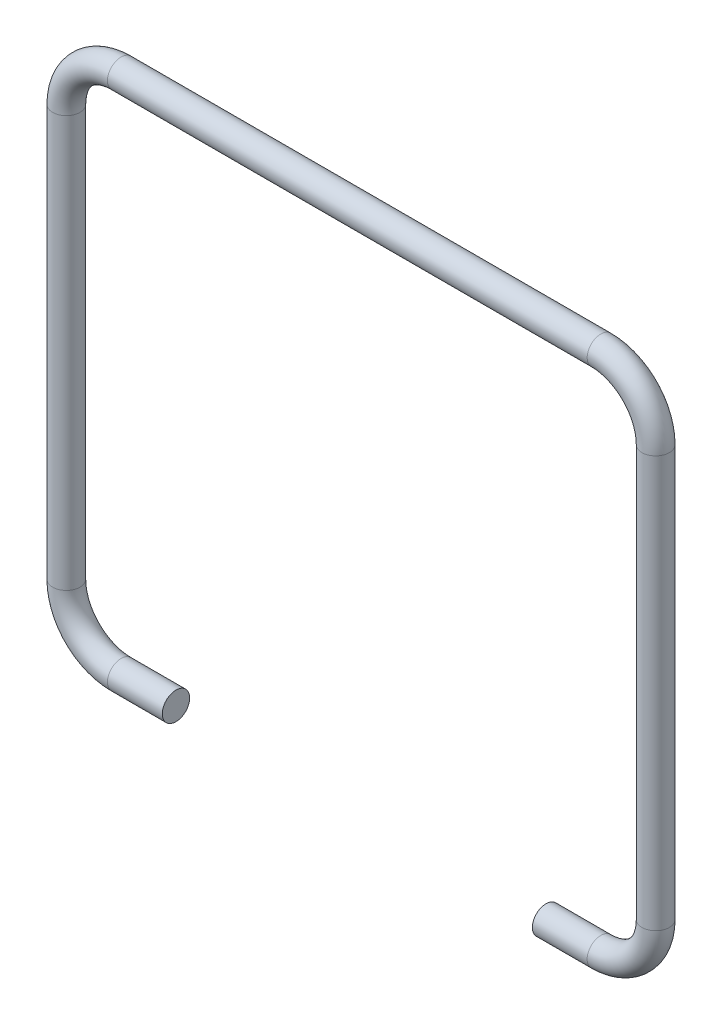
ISO-10303-21;
HEADER;
FILE_DESCRIPTION(('STEP AP214'),'2;1');
FILE_NAME('part.step','',(''),(''),'','','');
FILE_SCHEMA(('AUTOMOTIVE_DESIGN { 1 0 10303 214 1 1 1 1 }'));
ENDSEC;
DATA;
#1=APPLICATION_CONTEXT('core data for automotive mechanical design processes');
#2=APPLICATION_PROTOCOL_DEFINITION('international standard','automotive_design',2000,#1);
#3=PRODUCT_CONTEXT('',#1,'mechanical');
#4=PRODUCT('Part','Part','',(#3));
#5=PRODUCT_RELATED_PRODUCT_CATEGORY('part','',(#4));
#6=PRODUCT_DEFINITION_FORMATION('','',#4);
#7=PRODUCT_DEFINITION_CONTEXT('part definition',#1,'design');
#8=PRODUCT_DEFINITION('design','',#6,#7);
#9=PRODUCT_DEFINITION_SHAPE('','',#8);
#10=(LENGTH_UNIT() NAMED_UNIT(*) SI_UNIT(.MILLI.,.METRE.));
#11=(NAMED_UNIT(*) PLANE_ANGLE_UNIT() SI_UNIT($,.RADIAN.));
#12=(NAMED_UNIT(*) SI_UNIT($,.STERADIAN.) SOLID_ANGLE_UNIT());
#13=UNCERTAINTY_MEASURE_WITH_UNIT(LENGTH_MEASURE(1.E-05),#10,'distance_accuracy_value','');
#14=(GEOMETRIC_REPRESENTATION_CONTEXT(3) GLOBAL_UNCERTAINTY_ASSIGNED_CONTEXT((#13)) GLOBAL_UNIT_ASSIGNED_CONTEXT((#10,
#11,#12)) REPRESENTATION_CONTEXT('',''));
#15=CARTESIAN_POINT('',(0.,0.,0.));
#16=DIRECTION('',(0.,0.,1.));
#17=DIRECTION('',(1.,0.,0.));
#18=AXIS2_PLACEMENT_3D('',#15,#16,#17);
#19=CARTESIAN_POINT('',(6.75,0.,0.));
#20=DIRECTION('',(1.,0.,0.));
#21=DIRECTION('',(0.,1.,0.));
#22=AXIS2_PLACEMENT_3D('',#19,#20,#21);
#23=PLANE('',#22);
#24=CARTESIAN_POINT('',(6.75,0.,0.));
#25=DIRECTION('',(1.,0.,0.));
#26=DIRECTION('',(0.,1.,0.));
#27=AXIS2_PLACEMENT_3D('',#24,#25,#26);
#28=CIRCLE('',#27,0.5);
#29=CARTESIAN_POINT('',(6.75,0.5,0.));
#30=VERTEX_POINT('',#29);
#31=EDGE_CURVE('E85',#30,#30,#28,.T.);
#32=ORIENTED_EDGE('',*,*,#31,.F.);
#33=EDGE_LOOP('',(#32));
#34=FACE_BOUND('',#33,.T.);
#35=ADVANCED_FACE('F51',(#34),#23,.F.);
#36=CARTESIAN_POINT('',(-6.75,0.,0.));
#37=DIRECTION('',(1.,0.,0.));
#38=DIRECTION('',(0.,1.,0.));
#39=AXIS2_PLACEMENT_3D('',#36,#37,#38);
#40=PLANE('',#39);
#41=CARTESIAN_POINT('',(-6.75,0.,0.));
#42=DIRECTION('',(1.,0.,0.));
#43=DIRECTION('',(0.,1.,0.));
#44=AXIS2_PLACEMENT_3D('',#41,#42,#43);
#45=CIRCLE('',#44,0.5);
#46=CARTESIAN_POINT('',(-6.75,0.5,0.));
#47=VERTEX_POINT('',#46);
#48=EDGE_CURVE('E11',#47,#47,#45,.T.);
#49=ORIENTED_EDGE('',*,*,#48,.T.);
#50=EDGE_LOOP('',(#49));
#51=FACE_BOUND('',#50,.T.);
#52=ADVANCED_FACE('F92',(#51),#40,.T.);
#53=CARTESIAN_POINT('',(6.75,0.,0.));
#54=DIRECTION('',(1.,0.,0.));
#55=DIRECTION('',(0.,1.,0.));
#56=AXIS2_PLACEMENT_3D('',#53,#54,#55);
#57=CYLINDRICAL_SURFACE('',#56,0.5);
#58=CARTESIAN_POINT('',(8.75,0.,0.));
#59=DIRECTION('',(1.,0.,0.));
#60=DIRECTION('',(0.,1.,0.));
#61=AXIS2_PLACEMENT_3D('',#58,#59,#60);
#62=CIRCLE('',#61,0.5);
#63=CARTESIAN_POINT('',(8.75,-0.5,0.));
#64=VERTEX_POINT('',#63);
#65=EDGE_CURVE('E82',#64,#64,#62,.T.);
#66=ORIENTED_EDGE('',*,*,#65,.F.);
#67=EDGE_LOOP('',(#66));
#68=FACE_BOUND('',#67,.T.);
#69=ORIENTED_EDGE('',*,*,#31,.T.);
#70=EDGE_LOOP('',(#69));
#71=FACE_BOUND('',#70,.T.);
#72=ADVANCED_FACE('F89',(#68,#71),#57,.T.);
#73=CARTESIAN_POINT('',(8.75,2.,0.));
#74=DIRECTION('',(0.,0.,1.));
#75=DIRECTION('',(1.,0.,0.));
#76=AXIS2_PLACEMENT_3D('',#73,#74,#75);
#77=TOROIDAL_SURFACE('',#76,2.,0.5);
#78=CARTESIAN_POINT('',(10.75,2.,0.));
#79=DIRECTION('',(0.,1.,0.));
#80=DIRECTION('',(-1.,0.,0.));
#81=AXIS2_PLACEMENT_3D('',#78,#79,#80);
#82=CIRCLE('',#81,0.5);
#83=CARTESIAN_POINT('',(11.25,2.,0.));
#84=VERTEX_POINT('',#83);
#85=EDGE_CURVE('E79',#84,#84,#82,.T.);
#86=CARTESIAN_POINT('',(8.75,2.,0.));
#87=DIRECTION('',(0.,0.,1.));
#88=DIRECTION('',(1.,0.,0.));
#89=AXIS2_PLACEMENT_3D('',#86,#87,#88);
#90=CIRCLE('',#89,2.5);
#91=EDGE_CURVE('',#64,#84,#90,.T.);
#92=ORIENTED_EDGE('',*,*,#65,.T.);
#93=ORIENTED_EDGE('',*,*,#85,.F.);
#94=ORIENTED_EDGE('',*,*,#91,.T.);
#95=ORIENTED_EDGE('',*,*,#91,.F.);
#96=EDGE_LOOP('',(#92,#94,#93,#95));
#97=FACE_BOUND('',#96,.T.);
#98=ADVANCED_FACE('F126',(#97),#77,.T.);
#99=CARTESIAN_POINT('',(10.75,2.,0.));
#100=DIRECTION('',(0.,1.,0.));
#101=DIRECTION('',(0.,0.,1.));
#102=AXIS2_PLACEMENT_3D('',#99,#100,#101);
#103=CYLINDRICAL_SURFACE('',#102,0.5);
#104=CARTESIAN_POINT('',(10.75,17.,0.));
#105=DIRECTION('',(0.,1.,0.));
#106=DIRECTION('',(-1.,0.,0.));
#107=AXIS2_PLACEMENT_3D('',#104,#105,#106);
#108=CIRCLE('',#107,0.5);
#109=CARTESIAN_POINT('',(11.25,17.,0.));
#110=VERTEX_POINT('',#109);
#111=EDGE_CURVE('E76',#110,#110,#108,.T.);
#112=ORIENTED_EDGE('',*,*,#111,.F.);
#113=EDGE_LOOP('',(#112));
#114=FACE_BOUND('',#113,.T.);
#115=ORIENTED_EDGE('',*,*,#85,.T.);
#116=EDGE_LOOP('',(#115));
#117=FACE_BOUND('',#116,.T.);
#118=ADVANCED_FACE('F122',(#114,#117),#103,.T.);
#119=CARTESIAN_POINT('',(8.75,17.,0.));
#120=DIRECTION('',(0.,0.,1.));
#121=DIRECTION('',(1.,0.,0.));
#122=AXIS2_PLACEMENT_3D('',#119,#120,#121);
#123=TOROIDAL_SURFACE('',#122,2.,0.5);
#124=CARTESIAN_POINT('',(8.75,19.,0.));
#125=DIRECTION('',(-1.,0.,0.));
#126=DIRECTION('',(0.,-1.,0.));
#127=AXIS2_PLACEMENT_3D('',#124,#125,#126);
#128=CIRCLE('',#127,0.5);
#129=CARTESIAN_POINT('',(8.75,19.5,0.));
#130=VERTEX_POINT('',#129);
#131=EDGE_CURVE('E73',#130,#130,#128,.T.);
#132=CARTESIAN_POINT('',(8.75,17.,0.));
#133=DIRECTION('',(0.,0.,1.));
#134=DIRECTION('',(1.,0.,0.));
#135=AXIS2_PLACEMENT_3D('',#132,#133,#134);
#136=CIRCLE('',#135,2.5);
#137=EDGE_CURVE('',#110,#130,#136,.T.);
#138=ORIENTED_EDGE('',*,*,#111,.T.);
#139=ORIENTED_EDGE('',*,*,#131,.F.);
#140=ORIENTED_EDGE('',*,*,#137,.T.);
#141=ORIENTED_EDGE('',*,*,#137,.F.);
#142=EDGE_LOOP('',(#138,#140,#139,#141));
#143=FACE_BOUND('',#142,.T.);
#144=ADVANCED_FACE('F118',(#143),#123,.T.);
#145=CARTESIAN_POINT('',(8.75,19.,0.));
#146=DIRECTION('',(-1.,0.,0.));
#147=DIRECTION('',(0.,0.,1.));
#148=AXIS2_PLACEMENT_3D('',#145,#146,#147);
#149=CYLINDRICAL_SURFACE('',#148,0.5);
#150=CARTESIAN_POINT('',(-8.75,19.,0.));
#151=DIRECTION('',(-1.,0.,0.));
#152=DIRECTION('',(0.,-1.,0.));
#153=AXIS2_PLACEMENT_3D('',#150,#151,#152);
#154=CIRCLE('',#153,0.5);
#155=CARTESIAN_POINT('',(-8.75,19.5,0.));
#156=VERTEX_POINT('',#155);
#157=EDGE_CURVE('E70',#156,#156,#154,.T.);
#158=ORIENTED_EDGE('',*,*,#157,.F.);
#159=EDGE_LOOP('',(#158));
#160=FACE_BOUND('',#159,.T.);
#161=ORIENTED_EDGE('',*,*,#131,.T.);
#162=EDGE_LOOP('',(#161));
#163=FACE_BOUND('',#162,.T.);
#164=ADVANCED_FACE('F114',(#160,#163),#149,.T.);
#165=CARTESIAN_POINT('',(-8.75,17.,0.));
#166=DIRECTION('',(0.,0.,1.));
#167=DIRECTION('',(1.,0.,0.));
#168=AXIS2_PLACEMENT_3D('',#165,#166,#167);
#169=TOROIDAL_SURFACE('',#168,2.,0.5);
#170=CARTESIAN_POINT('',(-10.75,17.,0.));
#171=DIRECTION('',(0.,-1.,0.));
#172=DIRECTION('',(1.,0.,0.));
#173=AXIS2_PLACEMENT_3D('',#170,#171,#172);
#174=CIRCLE('',#173,0.5);
#175=CARTESIAN_POINT('',(-11.25,17.,0.));
#176=VERTEX_POINT('',#175);
#177=EDGE_CURVE('E65',#176,#176,#174,.T.);
#178=CARTESIAN_POINT('',(-8.75,17.,0.));
#179=DIRECTION('',(0.,0.,1.));
#180=DIRECTION('',(1.,0.,0.));
#181=AXIS2_PLACEMENT_3D('',#178,#179,#180);
#182=CIRCLE('',#181,2.5);
#183=EDGE_CURVE('',#156,#176,#182,.T.);
#184=ORIENTED_EDGE('',*,*,#157,.T.);
#185=ORIENTED_EDGE('',*,*,#177,.F.);
#186=ORIENTED_EDGE('',*,*,#183,.T.);
#187=ORIENTED_EDGE('',*,*,#183,.F.);
#188=EDGE_LOOP('',(#184,#186,#185,#187));
#189=FACE_BOUND('',#188,.T.);
#190=ADVANCED_FACE('F110',(#189),#169,.T.);
#191=CARTESIAN_POINT('',(-10.75,17.,0.));
#192=DIRECTION('',(0.,-1.,0.));
#193=DIRECTION('',(0.,0.,-1.));
#194=AXIS2_PLACEMENT_3D('',#191,#192,#193);
#195=CYLINDRICAL_SURFACE('',#194,0.5);
#196=CARTESIAN_POINT('',(-10.75,2.,0.));
#197=DIRECTION('',(0.,-1.,0.));
#198=DIRECTION('',(1.,0.,0.));
#199=AXIS2_PLACEMENT_3D('',#196,#197,#198);
#200=CIRCLE('',#199,0.5);
#201=CARTESIAN_POINT('',(-11.25,2.,0.));
#202=VERTEX_POINT('',#201);
#203=EDGE_CURVE('E61',#202,#202,#200,.T.);
#204=ORIENTED_EDGE('',*,*,#203,.F.);
#205=EDGE_LOOP('',(#204));
#206=FACE_BOUND('',#205,.T.);
#207=ORIENTED_EDGE('',*,*,#177,.T.);
#208=EDGE_LOOP('',(#207));
#209=FACE_BOUND('',#208,.T.);
#210=ADVANCED_FACE('F104',(#206,#209),#195,.T.);
#211=CARTESIAN_POINT('',(-8.75,2.,0.));
#212=DIRECTION('',(0.,0.,1.));
#213=DIRECTION('',(1.,0.,0.));
#214=AXIS2_PLACEMENT_3D('',#211,#212,#213);
#215=TOROIDAL_SURFACE('',#214,2.,0.5);
#216=CARTESIAN_POINT('',(-8.75,0.,0.));
#217=DIRECTION('',(1.,0.,0.));
#218=DIRECTION('',(0.,1.,0.));
#219=AXIS2_PLACEMENT_3D('',#216,#217,#218);
#220=CIRCLE('',#219,0.5);
#221=CARTESIAN_POINT('',(-8.75,-0.5,0.));
#222=VERTEX_POINT('',#221);
#223=EDGE_CURVE('E57',#222,#222,#220,.T.);
#224=CARTESIAN_POINT('',(-8.75,2.,0.));
#225=DIRECTION('',(0.,0.,1.));
#226=DIRECTION('',(1.,0.,0.));
#227=AXIS2_PLACEMENT_3D('',#224,#225,#226);
#228=CIRCLE('',#227,2.5);
#229=EDGE_CURVE('',#202,#222,#228,.T.);
#230=ORIENTED_EDGE('',*,*,#203,.T.);
#231=ORIENTED_EDGE('',*,*,#223,.F.);
#232=ORIENTED_EDGE('',*,*,#229,.T.);
#233=ORIENTED_EDGE('',*,*,#229,.F.);
#234=EDGE_LOOP('',(#230,#232,#231,#233));
#235=FACE_BOUND('',#234,.T.);
#236=ADVANCED_FACE('F98',(#235),#215,.T.);
#237=CARTESIAN_POINT('',(-8.75,0.,0.));
#238=DIRECTION('',(1.,0.,0.));
#239=DIRECTION('',(0.,1.,0.));
#240=AXIS2_PLACEMENT_3D('',#237,#238,#239);
#241=CYLINDRICAL_SURFACE('',#240,0.5);
#242=ORIENTED_EDGE('',*,*,#48,.F.);
#243=EDGE_LOOP('',(#242));
#244=FACE_BOUND('',#243,.T.);
#245=ORIENTED_EDGE('',*,*,#223,.T.);
#246=EDGE_LOOP('',(#245));
#247=FACE_BOUND('',#246,.T.);
#248=ADVANCED_FACE('F96',(#244,#247),#241,.T.);
#249=CLOSED_SHELL('',(#35,#52,#72,#98,#118,#144,#164,#190,#210,#236,#248));
#250=MANIFOLD_SOLID_BREP('B2',#249);
#251=ADVANCED_BREP_SHAPE_REPRESENTATION('',(#18,#250),#14);
#252=SHAPE_DEFINITION_REPRESENTATION(#9,#251);
ENDSEC;
END-ISO-10303-21;
